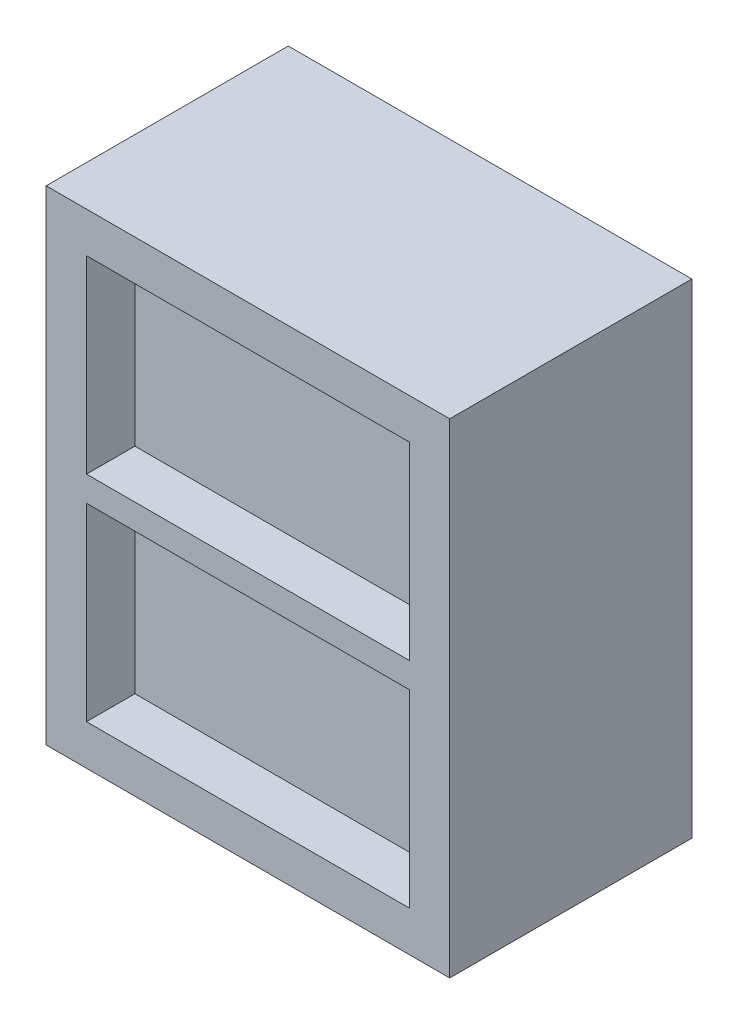
ISO-10303-21;
HEADER;
FILE_DESCRIPTION(('STEP AP214'),'2;1');
FILE_NAME('part.step','',(''),(''),'','','');
FILE_SCHEMA(('AUTOMOTIVE_DESIGN { 1 0 10303 214 1 1 1 1 }'));
ENDSEC;
DATA;
#1=APPLICATION_CONTEXT('core data for automotive mechanical design processes');
#2=APPLICATION_PROTOCOL_DEFINITION('international standard','automotive_design',2000,#1);
#3=PRODUCT_CONTEXT('',#1,'mechanical');
#4=PRODUCT('Part','Part','',(#3));
#5=PRODUCT_RELATED_PRODUCT_CATEGORY('part','',(#4));
#6=PRODUCT_DEFINITION_FORMATION('','',#4);
#7=PRODUCT_DEFINITION_CONTEXT('part definition',#1,'design');
#8=PRODUCT_DEFINITION('design','',#6,#7);
#9=PRODUCT_DEFINITION_SHAPE('','',#8);
#10=(LENGTH_UNIT() NAMED_UNIT(*) SI_UNIT(.MILLI.,.METRE.));
#11=(NAMED_UNIT(*) PLANE_ANGLE_UNIT() SI_UNIT($,.RADIAN.));
#12=(NAMED_UNIT(*) SI_UNIT($,.STERADIAN.) SOLID_ANGLE_UNIT());
#13=UNCERTAINTY_MEASURE_WITH_UNIT(LENGTH_MEASURE(1.E-05),#10,'distance_accuracy_value','');
#14=(GEOMETRIC_REPRESENTATION_CONTEXT(3) GLOBAL_UNCERTAINTY_ASSIGNED_CONTEXT((#13)) GLOBAL_UNIT_ASSIGNED_CONTEXT((#10,
#11,#12)) REPRESENTATION_CONTEXT('',''));
#15=CARTESIAN_POINT('',(0.,0.,0.));
#16=DIRECTION('',(0.,0.,1.));
#17=DIRECTION('',(1.,0.,0.));
#18=AXIS2_PLACEMENT_3D('',#15,#16,#17);
#19=CARTESIAN_POINT('',(0.,0.,1.5));
#20=DIRECTION('',(0.,0.,1.));
#21=DIRECTION('',(1.,0.,0.));
#22=AXIS2_PLACEMENT_3D('',#19,#20,#21);
#23=PLANE('',#22);
#24=DIRECTION('',(0.,-1.,0.));
#25=VECTOR('',#24,1.);
#26=CARTESIAN_POINT('',(1.,0.,1.5));
#27=LINE('',#26,#25);
#28=CARTESIAN_POINT('',(1.,1.25,1.5));
#29=VERTEX_POINT('',#28);
#30=CARTESIAN_POINT('',(1.,0.0781249999999998,1.5));
#31=VERTEX_POINT('',#30);
#32=EDGE_CURVE('E174',#29,#31,#27,.T.);
#33=ORIENTED_EDGE('',*,*,#32,.T.);
#34=DIRECTION('',(-1.,0.,0.));
#35=VECTOR('',#34,1.);
#36=CARTESIAN_POINT('',(0.,0.0781249999999998,1.5));
#37=LINE('',#36,#35);
#38=CARTESIAN_POINT('',(-1.,0.0781249999999998,1.5));
#39=VERTEX_POINT('',#38);
#40=EDGE_CURVE('E57',#31,#39,#37,.T.);
#41=ORIENTED_EDGE('',*,*,#40,.T.);
#42=DIRECTION('',(0.,-1.,0.));
#43=VECTOR('',#42,1.);
#44=CARTESIAN_POINT('',(-1.,0.,1.5));
#45=LINE('',#44,#43);
#46=CARTESIAN_POINT('',(-1.,1.25,1.5));
#47=VERTEX_POINT('',#46);
#48=EDGE_CURVE('E165',#47,#39,#45,.T.);
#49=ORIENTED_EDGE('',*,*,#48,.F.);
#50=DIRECTION('',(1.,0.,0.));
#51=VECTOR('',#50,1.);
#52=CARTESIAN_POINT('',(0.,1.25,1.5));
#53=LINE('',#52,#51);
#54=EDGE_CURVE('E177',#47,#29,#53,.T.);
#55=ORIENTED_EDGE('',*,*,#54,.T.);
#56=EDGE_LOOP('',(#33,#41,#49,#55));
#57=FACE_BOUND('',#56,.T.);
#58=DIRECTION('',(0.,1.,0.));
#59=VECTOR('',#58,1.);
#60=CARTESIAN_POINT('',(1.25,1.5,1.5));
#61=LINE('',#60,#59);
#62=CARTESIAN_POINT('',(1.25,-1.5,1.5));
#63=VERTEX_POINT('',#62);
#64=CARTESIAN_POINT('',(1.25,1.5,1.5));
#65=VERTEX_POINT('',#64);
#66=EDGE_CURVE('E190',#63,#65,#61,.T.);
#67=ORIENTED_EDGE('',*,*,#66,.T.);
#68=DIRECTION('',(-1.,0.,0.));
#69=VECTOR('',#68,1.);
#70=CARTESIAN_POINT('',(-1.25,1.5,1.5));
#71=LINE('',#70,#69);
#72=CARTESIAN_POINT('',(-1.25,1.5,1.5));
#73=VERTEX_POINT('',#72);
#74=EDGE_CURVE('E193',#65,#73,#71,.T.);
#75=ORIENTED_EDGE('',*,*,#74,.T.);
#76=DIRECTION('',(0.,-1.,0.));
#77=VECTOR('',#76,1.);
#78=CARTESIAN_POINT('',(-1.25,1.5,1.5));
#79=LINE('',#78,#77);
#80=CARTESIAN_POINT('',(-1.25,-1.5,1.5));
#81=VERTEX_POINT('',#80);
#82=EDGE_CURVE('E196',#73,#81,#79,.T.);
#83=ORIENTED_EDGE('',*,*,#82,.T.);
#84=DIRECTION('',(1.,0.,0.));
#85=VECTOR('',#84,1.);
#86=CARTESIAN_POINT('',(-1.25,-1.5,1.5));
#87=LINE('',#86,#85);
#88=EDGE_CURVE('E198',#81,#63,#87,.T.);
#89=ORIENTED_EDGE('',*,*,#88,.T.);
#90=EDGE_LOOP('',(#67,#75,#83,#89));
#91=FACE_BOUND('',#90,.T.);
#92=DIRECTION('',(-1.,0.,0.));
#93=VECTOR('',#92,1.);
#94=CARTESIAN_POINT('',(0.,-0.0781250000000002,1.5));
#95=LINE('',#94,#93);
#96=CARTESIAN_POINT('',(1.,-0.0781250000000002,1.5));
#97=VERTEX_POINT('',#96);
#98=CARTESIAN_POINT('',(-1.,-0.0781250000000002,1.5));
#99=VERTEX_POINT('',#98);
#100=EDGE_CURVE('E150',#97,#99,#95,.T.);
#101=ORIENTED_EDGE('',*,*,#100,.F.);
#102=DIRECTION('',(0.,-1.,0.));
#103=VECTOR('',#102,1.);
#104=CARTESIAN_POINT('',(1.,0.,1.5));
#105=LINE('',#104,#103);
#106=CARTESIAN_POINT('',(1.,-1.25,1.5));
#107=VERTEX_POINT('',#106);
#108=EDGE_CURVE('E49',#97,#107,#105,.T.);
#109=ORIENTED_EDGE('',*,*,#108,.T.);
#110=DIRECTION('',(1.,0.,0.));
#111=VECTOR('',#110,1.);
#112=CARTESIAN_POINT('',(0.,-1.25,1.5));
#113=LINE('',#112,#111);
#114=CARTESIAN_POINT('',(-1.,-1.25,1.5));
#115=VERTEX_POINT('',#114);
#116=EDGE_CURVE('E140',#115,#107,#113,.T.);
#117=ORIENTED_EDGE('',*,*,#116,.F.);
#118=DIRECTION('',(0.,-1.,0.));
#119=VECTOR('',#118,1.);
#120=CARTESIAN_POINT('',(-1.,0.,1.5));
#121=LINE('',#120,#119);
#122=EDGE_CURVE('E152',#99,#115,#121,.T.);
#123=ORIENTED_EDGE('',*,*,#122,.F.);
#124=EDGE_LOOP('',(#101,#109,#117,#123));
#125=FACE_BOUND('',#124,.T.);
#126=ADVANCED_FACE('F34',(#57,#91,#125),#23,.T.);
#127=CARTESIAN_POINT('',(1.25,1.5,1.5));
#128=DIRECTION('',(-1.,0.,0.));
#129=DIRECTION('',(0.,-1.,0.));
#130=AXIS2_PLACEMENT_3D('',#127,#128,#129);
#131=PLANE('',#130);
#132=DIRECTION('',(0.,1.,0.));
#133=VECTOR('',#132,1.);
#134=CARTESIAN_POINT('',(1.25,1.5,0.));
#135=LINE('',#134,#133);
#136=CARTESIAN_POINT('',(1.25,-1.5,0.));
#137=VERTEX_POINT('',#136);
#138=CARTESIAN_POINT('',(1.25,1.5,0.));
#139=VERTEX_POINT('',#138);
#140=EDGE_CURVE('E184',#137,#139,#135,.T.);
#141=ORIENTED_EDGE('',*,*,#140,.T.);
#142=DIRECTION('',(0.,0.,-1.));
#143=VECTOR('',#142,1.);
#144=CARTESIAN_POINT('',(1.25,1.5,1.5));
#145=LINE('',#144,#143);
#146=EDGE_CURVE('E11',#65,#139,#145,.T.);
#147=ORIENTED_EDGE('',*,*,#146,.F.);
#148=ORIENTED_EDGE('',*,*,#66,.F.);
#149=DIRECTION('',(0.,0.,-1.));
#150=VECTOR('',#149,1.);
#151=CARTESIAN_POINT('',(1.25,-1.5,1.5));
#152=LINE('',#151,#150);
#153=EDGE_CURVE('E200',#63,#137,#152,.T.);
#154=ORIENTED_EDGE('',*,*,#153,.T.);
#155=EDGE_LOOP('',(#141,#147,#148,#154));
#156=FACE_BOUND('',#155,.T.);
#157=ADVANCED_FACE('F36',(#156),#131,.F.);
#158=CARTESIAN_POINT('',(-1.25,1.5,1.5));
#159=DIRECTION('',(0.,-1.,0.));
#160=DIRECTION('',(0.,0.,-1.));
#161=AXIS2_PLACEMENT_3D('',#158,#159,#160);
#162=PLANE('',#161);
#163=DIRECTION('',(-1.,0.,0.));
#164=VECTOR('',#163,1.);
#165=CARTESIAN_POINT('',(-1.25,1.5,0.));
#166=LINE('',#165,#164);
#167=CARTESIAN_POINT('',(-1.25,1.5,0.));
#168=VERTEX_POINT('',#167);
#169=EDGE_CURVE('E203',#139,#168,#166,.T.);
#170=ORIENTED_EDGE('',*,*,#169,.T.);
#171=DIRECTION('',(0.,0.,-1.));
#172=VECTOR('',#171,1.);
#173=CARTESIAN_POINT('',(-1.25,1.5,1.5));
#174=LINE('',#173,#172);
#175=EDGE_CURVE('E42',#73,#168,#174,.T.);
#176=ORIENTED_EDGE('',*,*,#175,.F.);
#177=ORIENTED_EDGE('',*,*,#74,.F.);
#178=ORIENTED_EDGE('',*,*,#146,.T.);
#179=EDGE_LOOP('',(#170,#176,#177,#178));
#180=FACE_BOUND('',#179,.T.);
#181=ADVANCED_FACE('F233',(#180),#162,.F.);
#182=CARTESIAN_POINT('',(-1.25,1.5,1.5));
#183=DIRECTION('',(1.,0.,0.));
#184=DIRECTION('',(0.,1.,0.));
#185=AXIS2_PLACEMENT_3D('',#182,#183,#184);
#186=PLANE('',#185);
#187=DIRECTION('',(0.,-1.,0.));
#188=VECTOR('',#187,1.);
#189=CARTESIAN_POINT('',(-1.25,1.5,0.));
#190=LINE('',#189,#188);
#191=CARTESIAN_POINT('',(-1.25,-1.5,0.));
#192=VERTEX_POINT('',#191);
#193=EDGE_CURVE('E205',#168,#192,#190,.T.);
#194=ORIENTED_EDGE('',*,*,#193,.T.);
#195=DIRECTION('',(0.,0.,-1.));
#196=VECTOR('',#195,1.);
#197=CARTESIAN_POINT('',(-1.25,-1.5,1.5));
#198=LINE('',#197,#196);
#199=EDGE_CURVE('E210',#81,#192,#198,.T.);
#200=ORIENTED_EDGE('',*,*,#199,.F.);
#201=ORIENTED_EDGE('',*,*,#82,.F.);
#202=ORIENTED_EDGE('',*,*,#175,.T.);
#203=EDGE_LOOP('',(#194,#200,#201,#202));
#204=FACE_BOUND('',#203,.T.);
#205=ADVANCED_FACE('F217',(#204),#186,.F.);
#206=CARTESIAN_POINT('',(-1.25,-1.5,1.5));
#207=DIRECTION('',(0.,1.,0.));
#208=DIRECTION('',(0.,0.,1.));
#209=AXIS2_PLACEMENT_3D('',#206,#207,#208);
#210=PLANE('',#209);
#211=DIRECTION('',(1.,0.,0.));
#212=VECTOR('',#211,1.);
#213=CARTESIAN_POINT('',(-1.25,-1.5,0.));
#214=LINE('',#213,#212);
#215=EDGE_CURVE('E194',#192,#137,#214,.T.);
#216=ORIENTED_EDGE('',*,*,#215,.T.);
#217=ORIENTED_EDGE('',*,*,#153,.F.);
#218=ORIENTED_EDGE('',*,*,#88,.F.);
#219=ORIENTED_EDGE('',*,*,#199,.T.);
#220=EDGE_LOOP('',(#216,#217,#218,#219));
#221=FACE_BOUND('',#220,.T.);
#222=ADVANCED_FACE('F226',(#221),#210,.F.);
#223=CARTESIAN_POINT('',(0.,0.,0.));
#224=DIRECTION('',(0.,0.,1.));
#225=DIRECTION('',(1.,0.,0.));
#226=AXIS2_PLACEMENT_3D('',#223,#224,#225);
#227=PLANE('',#226);
#228=ORIENTED_EDGE('',*,*,#140,.F.);
#229=ORIENTED_EDGE('',*,*,#215,.F.);
#230=ORIENTED_EDGE('',*,*,#193,.F.);
#231=ORIENTED_EDGE('',*,*,#169,.F.);
#232=EDGE_LOOP('',(#228,#229,#230,#231));
#233=FACE_BOUND('',#232,.T.);
#234=ADVANCED_FACE('F223',(#233),#227,.F.);
#235=CARTESIAN_POINT('',(0.,0.0781249999999998,1.2));
#236=DIRECTION('',(0.,1.,0.));
#237=DIRECTION('',(-1.,0.,0.));
#238=AXIS2_PLACEMENT_3D('',#235,#236,#237);
#239=PLANE('',#238);
#240=ORIENTED_EDGE('',*,*,#40,.F.);
#241=DIRECTION('',(0.,0.,1.));
#242=VECTOR('',#241,1.);
#243=CARTESIAN_POINT('',(1.,0.0781249999999998,1.2));
#244=LINE('',#243,#242);
#245=CARTESIAN_POINT('',(1.,0.0781249999999998,1.2));
#246=VERTEX_POINT('',#245);
#247=EDGE_CURVE('E172',#246,#31,#244,.T.);
#248=ORIENTED_EDGE('',*,*,#247,.F.);
#249=DIRECTION('',(-1.,0.,0.));
#250=VECTOR('',#249,1.);
#251=CARTESIAN_POINT('',(0.,0.0781249999999998,1.2));
#252=LINE('',#251,#250);
#253=CARTESIAN_POINT('',(-1.,0.0781249999999998,1.2));
#254=VERTEX_POINT('',#253);
#255=EDGE_CURVE('E162',#246,#254,#252,.T.);
#256=ORIENTED_EDGE('',*,*,#255,.T.);
#257=DIRECTION('',(0.,0.,1.));
#258=VECTOR('',#257,1.);
#259=CARTESIAN_POINT('',(-1.,0.0781249999999998,1.2));
#260=LINE('',#259,#258);
#261=EDGE_CURVE('E182',#254,#39,#260,.T.);
#262=ORIENTED_EDGE('',*,*,#261,.T.);
#263=EDGE_LOOP('',(#240,#248,#256,#262));
#264=FACE_BOUND('',#263,.T.);
#265=ADVANCED_FACE('F247',(#264),#239,.T.);
#266=CARTESIAN_POINT('',(-1.,0.,1.2));
#267=DIRECTION('',(-1.,0.,0.));
#268=DIRECTION('',(0.,-1.,0.));
#269=AXIS2_PLACEMENT_3D('',#266,#267,#268);
#270=PLANE('',#269);
#271=ORIENTED_EDGE('',*,*,#48,.T.);
#272=ORIENTED_EDGE('',*,*,#261,.F.);
#273=DIRECTION('',(0.,-1.,0.));
#274=VECTOR('',#273,1.);
#275=CARTESIAN_POINT('',(-1.,0.,1.2));
#276=LINE('',#275,#274);
#277=CARTESIAN_POINT('',(-1.,1.25,1.2));
#278=VERTEX_POINT('',#277);
#279=EDGE_CURVE('E169',#278,#254,#276,.T.);
#280=ORIENTED_EDGE('',*,*,#279,.F.);
#281=DIRECTION('',(0.,0.,1.));
#282=VECTOR('',#281,1.);
#283=CARTESIAN_POINT('',(-1.,1.25,1.2));
#284=LINE('',#283,#282);
#285=EDGE_CURVE('E185',#278,#47,#284,.T.);
#286=ORIENTED_EDGE('',*,*,#285,.T.);
#287=EDGE_LOOP('',(#271,#272,#280,#286));
#288=FACE_BOUND('',#287,.T.);
#289=ADVANCED_FACE('F266',(#288),#270,.F.);
#290=CARTESIAN_POINT('',(0.,1.25,1.2));
#291=DIRECTION('',(0.,-1.,0.));
#292=DIRECTION('',(0.,0.,-1.));
#293=AXIS2_PLACEMENT_3D('',#290,#291,#292);
#294=PLANE('',#293);
#295=ORIENTED_EDGE('',*,*,#54,.F.);
#296=ORIENTED_EDGE('',*,*,#285,.F.);
#297=DIRECTION('',(1.,0.,0.));
#298=VECTOR('',#297,1.);
#299=CARTESIAN_POINT('',(0.,1.25,1.2));
#300=LINE('',#299,#298);
#301=CARTESIAN_POINT('',(1.,1.25,1.2));
#302=VERTEX_POINT('',#301);
#303=EDGE_CURVE('E167',#278,#302,#300,.T.);
#304=ORIENTED_EDGE('',*,*,#303,.T.);
#305=DIRECTION('',(0.,0.,1.));
#306=VECTOR('',#305,1.);
#307=CARTESIAN_POINT('',(1.,1.25,1.2));
#308=LINE('',#307,#306);
#309=EDGE_CURVE('E187',#302,#29,#308,.T.);
#310=ORIENTED_EDGE('',*,*,#309,.T.);
#311=EDGE_LOOP('',(#295,#296,#304,#310));
#312=FACE_BOUND('',#311,.T.);
#313=ADVANCED_FACE('F272',(#312),#294,.T.);
#314=CARTESIAN_POINT('',(1.,0.,1.2));
#315=DIRECTION('',(-1.,0.,0.));
#316=DIRECTION('',(0.,-1.,0.));
#317=AXIS2_PLACEMENT_3D('',#314,#315,#316);
#318=PLANE('',#317);
#319=ORIENTED_EDGE('',*,*,#32,.F.);
#320=ORIENTED_EDGE('',*,*,#309,.F.);
#321=DIRECTION('',(0.,-1.,0.));
#322=VECTOR('',#321,1.);
#323=CARTESIAN_POINT('',(1.,0.,1.2));
#324=LINE('',#323,#322);
#325=EDGE_CURVE('E164',#302,#246,#324,.T.);
#326=ORIENTED_EDGE('',*,*,#325,.T.);
#327=ORIENTED_EDGE('',*,*,#247,.T.);
#328=EDGE_LOOP('',(#319,#320,#326,#327));
#329=FACE_BOUND('',#328,.T.);
#330=ADVANCED_FACE('F280',(#329),#318,.T.);
#331=CARTESIAN_POINT('',(0.,0.,1.2));
#332=DIRECTION('',(0.,0.,1.));
#333=DIRECTION('',(1.,0.,0.));
#334=AXIS2_PLACEMENT_3D('',#331,#332,#333);
#335=PLANE('',#334);
#336=ORIENTED_EDGE('',*,*,#255,.F.);
#337=ORIENTED_EDGE('',*,*,#325,.F.);
#338=ORIENTED_EDGE('',*,*,#303,.F.);
#339=ORIENTED_EDGE('',*,*,#279,.T.);
#340=EDGE_LOOP('',(#336,#337,#338,#339));
#341=FACE_BOUND('',#340,.T.);
#342=ADVANCED_FACE('F288',(#341),#335,.T.);
#343=CARTESIAN_POINT('',(1.,0.,1.2));
#344=DIRECTION('',(-1.,0.,0.));
#345=DIRECTION('',(0.,-1.,0.));
#346=AXIS2_PLACEMENT_3D('',#343,#344,#345);
#347=PLANE('',#346);
#348=ORIENTED_EDGE('',*,*,#108,.F.);
#349=DIRECTION('',(0.,0.,1.));
#350=VECTOR('',#349,1.);
#351=CARTESIAN_POINT('',(1.,-0.0781250000000002,1.2));
#352=LINE('',#351,#350);
#353=CARTESIAN_POINT('',(1.,-0.0781250000000002,1.2));
#354=VERTEX_POINT('',#353);
#355=EDGE_CURVE('E121',#354,#97,#352,.T.);
#356=ORIENTED_EDGE('',*,*,#355,.F.);
#357=DIRECTION('',(0.,-1.,0.));
#358=VECTOR('',#357,1.);
#359=CARTESIAN_POINT('',(1.,0.,1.2));
#360=LINE('',#359,#358);
#361=CARTESIAN_POINT('',(1.,-1.25,1.2));
#362=VERTEX_POINT('',#361);
#363=EDGE_CURVE('E124',#354,#362,#360,.T.);
#364=ORIENTED_EDGE('',*,*,#363,.T.);
#365=DIRECTION('',(0.,0.,1.));
#366=VECTOR('',#365,1.);
#367=CARTESIAN_POINT('',(1.,-1.25,1.2));
#368=LINE('',#367,#366);
#369=EDGE_CURVE('E157',#362,#107,#368,.T.);
#370=ORIENTED_EDGE('',*,*,#369,.T.);
#371=EDGE_LOOP('',(#348,#356,#364,#370));
#372=FACE_BOUND('',#371,.T.);
#373=ADVANCED_FACE('F123',(#372),#347,.T.);
#374=CARTESIAN_POINT('',(0.,-1.25,1.2));
#375=DIRECTION('',(0.,-1.,0.));
#376=DIRECTION('',(0.,0.,-1.));
#377=AXIS2_PLACEMENT_3D('',#374,#375,#376);
#378=PLANE('',#377);
#379=ORIENTED_EDGE('',*,*,#116,.T.);
#380=ORIENTED_EDGE('',*,*,#369,.F.);
#381=DIRECTION('',(1.,0.,0.));
#382=VECTOR('',#381,1.);
#383=CARTESIAN_POINT('',(0.,-1.25,1.2));
#384=LINE('',#383,#382);
#385=CARTESIAN_POINT('',(-1.,-1.25,1.2));
#386=VERTEX_POINT('',#385);
#387=EDGE_CURVE('E131',#386,#362,#384,.T.);
#388=ORIENTED_EDGE('',*,*,#387,.F.);
#389=DIRECTION('',(0.,0.,1.));
#390=VECTOR('',#389,1.);
#391=CARTESIAN_POINT('',(-1.,-1.25,1.2));
#392=LINE('',#391,#390);
#393=EDGE_CURVE('E159',#386,#115,#392,.T.);
#394=ORIENTED_EDGE('',*,*,#393,.T.);
#395=EDGE_LOOP('',(#379,#380,#388,#394));
#396=FACE_BOUND('',#395,.T.);
#397=ADVANCED_FACE('F303',(#396),#378,.F.);
#398=CARTESIAN_POINT('',(-1.,0.,1.2));
#399=DIRECTION('',(-1.,0.,0.));
#400=DIRECTION('',(0.,-1.,0.));
#401=AXIS2_PLACEMENT_3D('',#398,#399,#400);
#402=PLANE('',#401);
#403=ORIENTED_EDGE('',*,*,#122,.T.);
#404=ORIENTED_EDGE('',*,*,#393,.F.);
#405=DIRECTION('',(0.,-1.,0.));
#406=VECTOR('',#405,1.);
#407=CARTESIAN_POINT('',(-1.,0.,1.2));
#408=LINE('',#407,#406);
#409=CARTESIAN_POINT('',(-1.,-0.0781250000000002,1.2));
#410=VERTEX_POINT('',#409);
#411=EDGE_CURVE('E144',#410,#386,#408,.T.);
#412=ORIENTED_EDGE('',*,*,#411,.F.);
#413=DIRECTION('',(0.,0.,1.));
#414=VECTOR('',#413,1.);
#415=CARTESIAN_POINT('',(-1.,-0.0781250000000002,1.2));
#416=LINE('',#415,#414);
#417=EDGE_CURVE('E130',#410,#99,#416,.T.);
#418=ORIENTED_EDGE('',*,*,#417,.T.);
#419=EDGE_LOOP('',(#403,#404,#412,#418));
#420=FACE_BOUND('',#419,.T.);
#421=ADVANCED_FACE('F310',(#420),#402,.F.);
#422=CARTESIAN_POINT('',(0.,-0.0781250000000002,1.2));
#423=DIRECTION('',(0.,1.,0.));
#424=DIRECTION('',(-1.,0.,0.));
#425=AXIS2_PLACEMENT_3D('',#422,#423,#424);
#426=PLANE('',#425);
#427=ORIENTED_EDGE('',*,*,#100,.T.);
#428=ORIENTED_EDGE('',*,*,#417,.F.);
#429=DIRECTION('',(-1.,0.,0.));
#430=VECTOR('',#429,1.);
#431=CARTESIAN_POINT('',(0.,-0.0781250000000002,1.2));
#432=LINE('',#431,#430);
#433=EDGE_CURVE('E138',#354,#410,#432,.T.);
#434=ORIENTED_EDGE('',*,*,#433,.F.);
#435=ORIENTED_EDGE('',*,*,#355,.T.);
#436=EDGE_LOOP('',(#427,#428,#434,#435));
#437=FACE_BOUND('',#436,.T.);
#438=ADVANCED_FACE('F142',(#437),#426,.F.);
#439=CARTESIAN_POINT('',(0.,0.,1.2));
#440=DIRECTION('',(0.,0.,1.));
#441=DIRECTION('',(1.,0.,0.));
#442=AXIS2_PLACEMENT_3D('',#439,#440,#441);
#443=PLANE('',#442);
#444=ORIENTED_EDGE('',*,*,#363,.F.);
#445=ORIENTED_EDGE('',*,*,#433,.T.);
#446=ORIENTED_EDGE('',*,*,#411,.T.);
#447=ORIENTED_EDGE('',*,*,#387,.T.);
#448=EDGE_LOOP('',(#444,#445,#446,#447));
#449=FACE_BOUND('',#448,.T.);
#450=ADVANCED_FACE('F136',(#449),#443,.T.);
#451=CLOSED_SHELL('',(#126,#157,#181,#205,#222,#234,#265,#289,#313,#330,#342,#373,#397,#421,
#438,#450));
#452=MANIFOLD_SOLID_BREP('B2',#451);
#453=ADVANCED_BREP_SHAPE_REPRESENTATION('',(#18,#452),#14);
#454=SHAPE_DEFINITION_REPRESENTATION(#9,#453);
ENDSEC;
END-ISO-10303-21;
